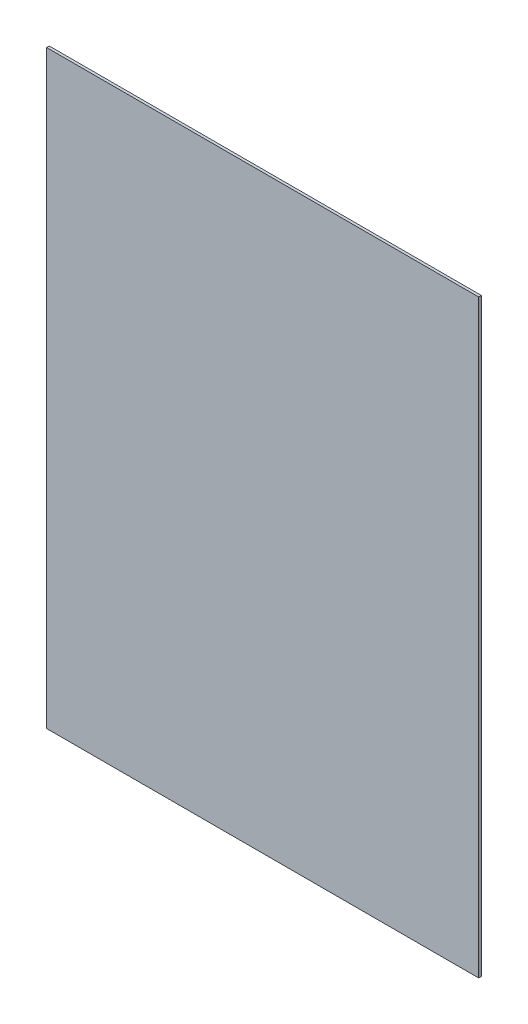
ISO-10303-21;
HEADER;
FILE_DESCRIPTION(('STEP AP214'),'2;1');
FILE_NAME('part.step','',(''),(''),'','','');
FILE_SCHEMA(('AUTOMOTIVE_DESIGN { 1 0 10303 214 1 1 1 1 }'));
ENDSEC;
DATA;
#1=APPLICATION_CONTEXT('core data for automotive mechanical design processes');
#2=APPLICATION_PROTOCOL_DEFINITION('international standard','automotive_design',2000,#1);
#3=PRODUCT_CONTEXT('',#1,'mechanical');
#4=PRODUCT('Part','Part','',(#3));
#5=PRODUCT_RELATED_PRODUCT_CATEGORY('part','',(#4));
#6=PRODUCT_DEFINITION_FORMATION('','',#4);
#7=PRODUCT_DEFINITION_CONTEXT('part definition',#1,'design');
#8=PRODUCT_DEFINITION('design','',#6,#7);
#9=PRODUCT_DEFINITION_SHAPE('','',#8);
#10=(LENGTH_UNIT() NAMED_UNIT(*) SI_UNIT(.MILLI.,.METRE.));
#11=(NAMED_UNIT(*) PLANE_ANGLE_UNIT() SI_UNIT($,.RADIAN.));
#12=(NAMED_UNIT(*) SI_UNIT($,.STERADIAN.) SOLID_ANGLE_UNIT());
#13=UNCERTAINTY_MEASURE_WITH_UNIT(LENGTH_MEASURE(1.E-05),#10,'distance_accuracy_value','');
#14=(GEOMETRIC_REPRESENTATION_CONTEXT(3) GLOBAL_UNCERTAINTY_ASSIGNED_CONTEXT((#13)) GLOBAL_UNIT_ASSIGNED_CONTEXT((#10,
#11,#12)) REPRESENTATION_CONTEXT('',''));
#15=CARTESIAN_POINT('',(0.,0.,0.));
#16=DIRECTION('',(0.,0.,1.));
#17=DIRECTION('',(1.,0.,0.));
#18=AXIS2_PLACEMENT_3D('',#15,#16,#17);
#19=CARTESIAN_POINT('',(165.,225.24,2.032));
#20=DIRECTION('',(-1.,0.,0.));
#21=DIRECTION('',(0.,-1.,0.));
#22=AXIS2_PLACEMENT_3D('',#19,#20,#21);
#23=PLANE('',#22);
#24=DIRECTION('',(0.,1.,0.));
#25=VECTOR('',#24,1.);
#26=CARTESIAN_POINT('',(165.,225.24,0.));
#27=LINE('',#26,#25);
#28=CARTESIAN_POINT('',(165.,-225.24,0.));
#29=VERTEX_POINT('',#28);
#30=CARTESIAN_POINT('',(165.,225.24,0.));
#31=VERTEX_POINT('',#30);
#32=EDGE_CURVE('E102',#29,#31,#27,.T.);
#33=ORIENTED_EDGE('',*,*,#32,.T.);
#34=DIRECTION('',(0.,0.,-1.));
#35=VECTOR('',#34,1.);
#36=CARTESIAN_POINT('',(165.,225.24,2.032));
#37=LINE('',#36,#35);
#38=CARTESIAN_POINT('',(165.,225.24,2.032));
#39=VERTEX_POINT('',#38);
#40=EDGE_CURVE('E11',#39,#31,#37,.T.);
#41=ORIENTED_EDGE('',*,*,#40,.F.);
#42=DIRECTION('',(0.,1.,0.));
#43=VECTOR('',#42,1.);
#44=CARTESIAN_POINT('',(165.,225.24,2.032));
#45=LINE('',#44,#43);
#46=CARTESIAN_POINT('',(165.,-225.24,2.032));
#47=VERTEX_POINT('',#46);
#48=EDGE_CURVE('E90',#47,#39,#45,.T.);
#49=ORIENTED_EDGE('',*,*,#48,.F.);
#50=DIRECTION('',(0.,0.,-1.));
#51=VECTOR('',#50,1.);
#52=CARTESIAN_POINT('',(165.,-225.24,2.032));
#53=LINE('',#52,#51);
#54=EDGE_CURVE('E98',#47,#29,#53,.T.);
#55=ORIENTED_EDGE('',*,*,#54,.T.);
#56=EDGE_LOOP('',(#33,#41,#49,#55));
#57=FACE_BOUND('',#56,.T.);
#58=ADVANCED_FACE('F39',(#57),#23,.F.);
#59=CARTESIAN_POINT('',(-165.,225.24,2.032));
#60=DIRECTION('',(0.,-1.,0.));
#61=DIRECTION('',(0.,0.,-1.));
#62=AXIS2_PLACEMENT_3D('',#59,#60,#61);
#63=PLANE('',#62);
#64=DIRECTION('',(-1.,0.,0.));
#65=VECTOR('',#64,1.);
#66=CARTESIAN_POINT('',(-165.,225.24,0.));
#67=LINE('',#66,#65);
#68=CARTESIAN_POINT('',(-165.,225.24,0.));
#69=VERTEX_POINT('',#68);
#70=EDGE_CURVE('E94',#31,#69,#67,.T.);
#71=ORIENTED_EDGE('',*,*,#70,.T.);
#72=DIRECTION('',(0.,0.,-1.));
#73=VECTOR('',#72,1.);
#74=CARTESIAN_POINT('',(-165.,225.24,2.032));
#75=LINE('',#74,#73);
#76=CARTESIAN_POINT('',(-165.,225.24,2.032));
#77=VERTEX_POINT('',#76);
#78=EDGE_CURVE('E47',#77,#69,#75,.T.);
#79=ORIENTED_EDGE('',*,*,#78,.F.);
#80=DIRECTION('',(-1.,0.,0.));
#81=VECTOR('',#80,1.);
#82=CARTESIAN_POINT('',(-165.,225.24,2.032));
#83=LINE('',#82,#81);
#84=EDGE_CURVE('E85',#39,#77,#83,.T.);
#85=ORIENTED_EDGE('',*,*,#84,.F.);
#86=ORIENTED_EDGE('',*,*,#40,.T.);
#87=EDGE_LOOP('',(#71,#79,#85,#86));
#88=FACE_BOUND('',#87,.T.);
#89=ADVANCED_FACE('F93',(#88),#63,.F.);
#90=CARTESIAN_POINT('',(-165.,225.24,2.032));
#91=DIRECTION('',(1.,0.,0.));
#92=DIRECTION('',(0.,1.,0.));
#93=AXIS2_PLACEMENT_3D('',#90,#91,#92);
#94=PLANE('',#93);
#95=DIRECTION('',(0.,-1.,0.));
#96=VECTOR('',#95,1.);
#97=CARTESIAN_POINT('',(-165.,225.24,0.));
#98=LINE('',#97,#96);
#99=CARTESIAN_POINT('',(-165.,-225.24,0.));
#100=VERTEX_POINT('',#99);
#101=EDGE_CURVE('E72',#69,#100,#98,.T.);
#102=ORIENTED_EDGE('',*,*,#101,.T.);
#103=DIRECTION('',(0.,0.,-1.));
#104=VECTOR('',#103,1.);
#105=CARTESIAN_POINT('',(-165.,-225.24,2.032));
#106=LINE('',#105,#104);
#107=CARTESIAN_POINT('',(-165.,-225.24,2.032));
#108=VERTEX_POINT('',#107);
#109=EDGE_CURVE('E95',#108,#100,#106,.T.);
#110=ORIENTED_EDGE('',*,*,#109,.F.);
#111=DIRECTION('',(0.,-1.,0.));
#112=VECTOR('',#111,1.);
#113=CARTESIAN_POINT('',(-165.,225.24,2.032));
#114=LINE('',#113,#112);
#115=EDGE_CURVE('E88',#77,#108,#114,.T.);
#116=ORIENTED_EDGE('',*,*,#115,.F.);
#117=ORIENTED_EDGE('',*,*,#78,.T.);
#118=EDGE_LOOP('',(#102,#110,#116,#117));
#119=FACE_BOUND('',#118,.T.);
#120=ADVANCED_FACE('F96',(#119),#94,.F.);
#121=CARTESIAN_POINT('',(-165.,-225.24,2.032));
#122=DIRECTION('',(0.,1.,0.));
#123=DIRECTION('',(0.,0.,1.));
#124=AXIS2_PLACEMENT_3D('',#121,#122,#123);
#125=PLANE('',#124);
#126=DIRECTION('',(1.,0.,0.));
#127=VECTOR('',#126,1.);
#128=CARTESIAN_POINT('',(-165.,-225.24,0.));
#129=LINE('',#128,#127);
#130=EDGE_CURVE('E78',#100,#29,#129,.T.);
#131=ORIENTED_EDGE('',*,*,#130,.T.);
#132=ORIENTED_EDGE('',*,*,#54,.F.);
#133=DIRECTION('',(1.,0.,0.));
#134=VECTOR('',#133,1.);
#135=CARTESIAN_POINT('',(-165.,-225.24,2.032));
#136=LINE('',#135,#134);
#137=EDGE_CURVE('E55',#108,#47,#136,.T.);
#138=ORIENTED_EDGE('',*,*,#137,.F.);
#139=ORIENTED_EDGE('',*,*,#109,.T.);
#140=EDGE_LOOP('',(#131,#132,#138,#139));
#141=FACE_BOUND('',#140,.T.);
#142=ADVANCED_FACE('F109',(#141),#125,.F.);
#143=CARTESIAN_POINT('',(0.,0.,2.032));
#144=DIRECTION('',(0.,0.,1.));
#145=DIRECTION('',(1.,0.,0.));
#146=AXIS2_PLACEMENT_3D('',#143,#144,#145);
#147=PLANE('',#146);
#148=ORIENTED_EDGE('',*,*,#48,.T.);
#149=ORIENTED_EDGE('',*,*,#84,.T.);
#150=ORIENTED_EDGE('',*,*,#115,.T.);
#151=ORIENTED_EDGE('',*,*,#137,.T.);
#152=EDGE_LOOP('',(#148,#149,#150,#151));
#153=FACE_BOUND('',#152,.T.);
#154=ADVANCED_FACE('F86',(#153),#147,.T.);
#155=CARTESIAN_POINT('',(0.,0.,0.));
#156=DIRECTION('',(0.,0.,1.));
#157=DIRECTION('',(1.,0.,0.));
#158=AXIS2_PLACEMENT_3D('',#155,#156,#157);
#159=PLANE('',#158);
#160=ORIENTED_EDGE('',*,*,#32,.F.);
#161=ORIENTED_EDGE('',*,*,#130,.F.);
#162=ORIENTED_EDGE('',*,*,#101,.F.);
#163=ORIENTED_EDGE('',*,*,#70,.F.);
#164=EDGE_LOOP('',(#160,#161,#162,#163));
#165=FACE_BOUND('',#164,.T.);
#166=ADVANCED_FACE('F112',(#165),#159,.F.);
#167=CLOSED_SHELL('',(#58,#89,#120,#142,#154,#166));
#168=MANIFOLD_SOLID_BREP('B2',#167);
#169=ADVANCED_BREP_SHAPE_REPRESENTATION('',(#18,#168),#14);
#170=SHAPE_DEFINITION_REPRESENTATION(#9,#169);
ENDSEC;
END-ISO-10303-21;
